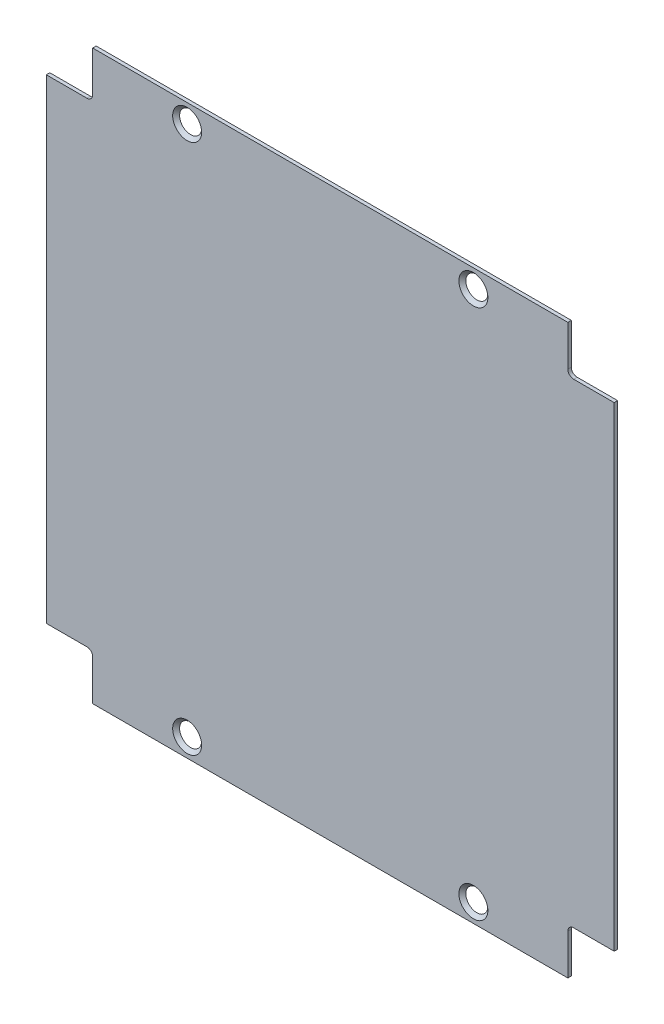
ISO-10303-21;
HEADER;
FILE_DESCRIPTION(('STEP AP214'),'2;1');
FILE_NAME('part.step','',(''),(''),'','','');
FILE_SCHEMA(('AUTOMOTIVE_DESIGN { 1 0 10303 214 1 1 1 1 }'));
ENDSEC;
DATA;
#1=APPLICATION_CONTEXT('core data for automotive mechanical design processes');
#2=APPLICATION_PROTOCOL_DEFINITION('international standard','automotive_design',2000,#1);
#3=PRODUCT_CONTEXT('',#1,'mechanical');
#4=PRODUCT('Part','Part','',(#3));
#5=PRODUCT_RELATED_PRODUCT_CATEGORY('part','',(#4));
#6=PRODUCT_DEFINITION_FORMATION('','',#4);
#7=PRODUCT_DEFINITION_CONTEXT('part definition',#1,'design');
#8=PRODUCT_DEFINITION('design','',#6,#7);
#9=PRODUCT_DEFINITION_SHAPE('','',#8);
#10=(LENGTH_UNIT() NAMED_UNIT(*) SI_UNIT(.MILLI.,.METRE.));
#11=(NAMED_UNIT(*) PLANE_ANGLE_UNIT() SI_UNIT($,.RADIAN.));
#12=(NAMED_UNIT(*) SI_UNIT($,.STERADIAN.) SOLID_ANGLE_UNIT());
#13=UNCERTAINTY_MEASURE_WITH_UNIT(LENGTH_MEASURE(1.E-05),#10,'distance_accuracy_value','');
#14=(GEOMETRIC_REPRESENTATION_CONTEXT(3) GLOBAL_UNCERTAINTY_ASSIGNED_CONTEXT((#13)) GLOBAL_UNIT_ASSIGNED_CONTEXT((#10,
#11,#12)) REPRESENTATION_CONTEXT('',''));
#15=CARTESIAN_POINT('',(0.,0.,0.));
#16=DIRECTION('',(0.,0.,1.));
#17=DIRECTION('',(1.,0.,0.));
#18=AXIS2_PLACEMENT_3D('',#15,#16,#17);
#19=CARTESIAN_POINT('',(0.,0.,0.6));
#20=DIRECTION('',(0.,0.,1.));
#21=DIRECTION('',(1.,0.,0.));
#22=AXIS2_PLACEMENT_3D('',#19,#20,#21);
#23=PLANE('',#22);
#24=CARTESIAN_POINT('',(73.7,94.8,0.6));
#25=DIRECTION('',(0.,0.,1.));
#26=DIRECTION('',(1.,0.,0.));
#27=AXIS2_PLACEMENT_3D('',#24,#25,#26);
#28=CIRCLE('',#27,2.50000738707713);
#29=CARTESIAN_POINT('',(76.2000073870771,94.8,0.6));
#30=VERTEX_POINT('',#29);
#31=EDGE_CURVE('E236',#30,#30,#28,.F.);
#32=ORIENTED_EDGE('',*,*,#31,.T.);
#33=EDGE_LOOP('',(#32));
#34=FACE_BOUND('',#33,.T.);
#35=CARTESIAN_POINT('',(73.7,3.2,0.6));
#36=DIRECTION('',(0.,0.,1.));
#37=DIRECTION('',(1.,0.,0.));
#38=AXIS2_PLACEMENT_3D('',#35,#36,#37);
#39=CIRCLE('',#38,2.50000738721893);
#40=CARTESIAN_POINT('',(76.2000073872189,3.2,0.6));
#41=VERTEX_POINT('',#40);
#42=EDGE_CURVE('E239',#41,#41,#39,.F.);
#43=ORIENTED_EDGE('',*,*,#42,.T.);
#44=EDGE_LOOP('',(#43));
#45=FACE_BOUND('',#44,.T.);
#46=CARTESIAN_POINT('',(24.3,3.2,0.6));
#47=DIRECTION('',(0.,0.,1.));
#48=DIRECTION('',(1.,0.,0.));
#49=AXIS2_PLACEMENT_3D('',#46,#47,#48);
#50=CIRCLE('',#49,2.50000738721893);
#51=CARTESIAN_POINT('',(26.8000073872189,3.2,0.6));
#52=VERTEX_POINT('',#51);
#53=EDGE_CURVE('E242',#52,#52,#50,.F.);
#54=ORIENTED_EDGE('',*,*,#53,.T.);
#55=EDGE_LOOP('',(#54));
#56=FACE_BOUND('',#55,.T.);
#57=CARTESIAN_POINT('',(24.3,94.8,0.6));
#58=DIRECTION('',(0.,0.,1.));
#59=DIRECTION('',(1.,0.,0.));
#60=AXIS2_PLACEMENT_3D('',#57,#58,#59);
#61=CIRCLE('',#60,2.50000738707713);
#62=CARTESIAN_POINT('',(26.8000073870771,94.8,0.6));
#63=VERTEX_POINT('',#62);
#64=EDGE_CURVE('E141',#63,#63,#61,.F.);
#65=ORIENTED_EDGE('',*,*,#64,.T.);
#66=EDGE_LOOP('',(#65));
#67=FACE_BOUND('',#66,.T.);
#68=DIRECTION('',(1.,0.,0.));
#69=VECTOR('',#68,1.);
#70=CARTESIAN_POINT('',(91.,90.,0.6));
#71=LINE('',#70,#69);
#72=CARTESIAN_POINT('',(98.,90.,0.6));
#73=VERTEX_POINT('',#72);
#74=CARTESIAN_POINT('',(91.,90.,0.6));
#75=VERTEX_POINT('',#74);
#76=EDGE_CURVE('E139',#73,#75,#71,.F.);
#77=ORIENTED_EDGE('',*,*,#76,.T.);
#78=CARTESIAN_POINT('',(91.,91.,0.6));
#79=DIRECTION('',(0.,0.,1.));
#80=DIRECTION('',(1.,0.,0.));
#81=AXIS2_PLACEMENT_3D('',#78,#79,#80);
#82=CIRCLE('',#81,1.);
#83=CARTESIAN_POINT('',(90.,91.,0.6));
#84=VERTEX_POINT('',#83);
#85=EDGE_CURVE('E20',#75,#84,#82,.F.);
#86=ORIENTED_EDGE('',*,*,#85,.T.);
#87=DIRECTION('',(0.,1.,0.));
#88=VECTOR('',#87,1.);
#89=CARTESIAN_POINT('',(90.,98.,0.6));
#90=LINE('',#89,#88);
#91=CARTESIAN_POINT('',(90.,98.,0.6));
#92=VERTEX_POINT('',#91);
#93=EDGE_CURVE('E204',#84,#92,#90,.T.);
#94=ORIENTED_EDGE('',*,*,#93,.T.);
#95=DIRECTION('',(1.,0.,0.));
#96=VECTOR('',#95,1.);
#97=CARTESIAN_POINT('',(98.,98.,0.6));
#98=LINE('',#97,#96);
#99=CARTESIAN_POINT('',(8.,98.,0.6));
#100=VERTEX_POINT('',#99);
#101=EDGE_CURVE('E201',#100,#92,#98,.T.);
#102=ORIENTED_EDGE('',*,*,#101,.F.);
#103=DIRECTION('',(0.,1.,0.));
#104=VECTOR('',#103,1.);
#105=CARTESIAN_POINT('',(8.,91.,0.6));
#106=LINE('',#105,#104);
#107=CARTESIAN_POINT('',(8.,91.,0.6));
#108=VERTEX_POINT('',#107);
#109=EDGE_CURVE('E195',#100,#108,#106,.F.);
#110=ORIENTED_EDGE('',*,*,#109,.T.);
#111=CARTESIAN_POINT('',(7.,91.,0.6));
#112=DIRECTION('',(0.,0.,1.));
#113=DIRECTION('',(1.,0.,0.));
#114=AXIS2_PLACEMENT_3D('',#111,#112,#113);
#115=CIRCLE('',#114,1.);
#116=CARTESIAN_POINT('',(7.,90.,0.6));
#117=VERTEX_POINT('',#116);
#118=EDGE_CURVE('E250',#108,#117,#115,.F.);
#119=ORIENTED_EDGE('',*,*,#118,.T.);
#120=DIRECTION('',(1.,0.,0.));
#121=VECTOR('',#120,1.);
#122=CARTESIAN_POINT('',(0.,90.,0.6));
#123=LINE('',#122,#121);
#124=CARTESIAN_POINT('',(0.,90.,0.6));
#125=VERTEX_POINT('',#124);
#126=EDGE_CURVE('E187',#117,#125,#123,.F.);
#127=ORIENTED_EDGE('',*,*,#126,.T.);
#128=DIRECTION('',(0.,1.,0.));
#129=VECTOR('',#128,1.);
#130=CARTESIAN_POINT('',(0.,98.,0.6));
#131=LINE('',#130,#129);
#132=CARTESIAN_POINT('',(0.,8.,0.6));
#133=VERTEX_POINT('',#132);
#134=EDGE_CURVE('E184',#133,#125,#131,.T.);
#135=ORIENTED_EDGE('',*,*,#134,.F.);
#136=DIRECTION('',(1.,0.,0.));
#137=VECTOR('',#136,1.);
#138=CARTESIAN_POINT('',(7.,8.,0.6));
#139=LINE('',#138,#137);
#140=CARTESIAN_POINT('',(7.,8.,0.6));
#141=VERTEX_POINT('',#140);
#142=EDGE_CURVE('E178',#133,#141,#139,.T.);
#143=ORIENTED_EDGE('',*,*,#142,.T.);
#144=CARTESIAN_POINT('',(7.,7.,0.6));
#145=DIRECTION('',(0.,0.,1.));
#146=DIRECTION('',(1.,0.,0.));
#147=AXIS2_PLACEMENT_3D('',#144,#145,#146);
#148=CIRCLE('',#147,1.);
#149=CARTESIAN_POINT('',(8.,7.,0.6));
#150=VERTEX_POINT('',#149);
#151=EDGE_CURVE('E249',#141,#150,#148,.F.);
#152=ORIENTED_EDGE('',*,*,#151,.T.);
#153=DIRECTION('',(0.,1.,0.));
#154=VECTOR('',#153,1.);
#155=CARTESIAN_POINT('',(8.,0.,0.6));
#156=LINE('',#155,#154);
#157=CARTESIAN_POINT('',(8.,0.,0.6));
#158=VERTEX_POINT('',#157);
#159=EDGE_CURVE('E170',#150,#158,#156,.F.);
#160=ORIENTED_EDGE('',*,*,#159,.T.);
#161=DIRECTION('',(1.,0.,0.));
#162=VECTOR('',#161,1.);
#163=CARTESIAN_POINT('',(0.,0.,0.6));
#164=LINE('',#163,#162);
#165=CARTESIAN_POINT('',(90.,0.,0.6));
#166=VERTEX_POINT('',#165);
#167=EDGE_CURVE('E167',#166,#158,#164,.F.);
#168=ORIENTED_EDGE('',*,*,#167,.F.);
#169=DIRECTION('',(0.,1.,0.));
#170=VECTOR('',#169,1.);
#171=CARTESIAN_POINT('',(90.,7.,0.6));
#172=LINE('',#171,#170);
#173=CARTESIAN_POINT('',(90.,7.,0.6));
#174=VERTEX_POINT('',#173);
#175=EDGE_CURVE('E161',#166,#174,#172,.T.);
#176=ORIENTED_EDGE('',*,*,#175,.T.);
#177=CARTESIAN_POINT('',(91.,7.,0.6));
#178=DIRECTION('',(0.,0.,1.));
#179=DIRECTION('',(1.,0.,0.));
#180=AXIS2_PLACEMENT_3D('',#177,#178,#179);
#181=CIRCLE('',#180,1.);
#182=CARTESIAN_POINT('',(91.,8.,0.6));
#183=VERTEX_POINT('',#182);
#184=EDGE_CURVE('E247',#174,#183,#181,.F.);
#185=ORIENTED_EDGE('',*,*,#184,.T.);
#186=DIRECTION('',(1.,0.,0.));
#187=VECTOR('',#186,1.);
#188=CARTESIAN_POINT('',(98.,8.,0.6));
#189=LINE('',#188,#187);
#190=CARTESIAN_POINT('',(98.,8.,0.6));
#191=VERTEX_POINT('',#190);
#192=EDGE_CURVE('E154',#183,#191,#189,.T.);
#193=ORIENTED_EDGE('',*,*,#192,.T.);
#194=DIRECTION('',(0.,1.,0.));
#195=VECTOR('',#194,1.);
#196=CARTESIAN_POINT('',(98.,0.,0.6));
#197=LINE('',#196,#195);
#198=EDGE_CURVE('E144',#73,#191,#197,.F.);
#199=ORIENTED_EDGE('',*,*,#198,.F.);
#200=EDGE_LOOP('',(#77,#86,#94,#102,#110,#119,#127,#135,#143,#152,#160,#168,#176,#185,#193,#199));
#201=FACE_BOUND('',#200,.T.);
#202=ADVANCED_FACE('F17',(#34,#45,#56,#67,#201),#23,.T.);
#203=CARTESIAN_POINT('',(91.,91.,0.));
#204=DIRECTION('',(0.,0.,1.));
#205=DIRECTION('',(1.,0.,0.));
#206=AXIS2_PLACEMENT_3D('',#203,#204,#205);
#207=CYLINDRICAL_SURFACE('',#206,1.);
#208=ORIENTED_EDGE('',*,*,#85,.F.);
#209=DIRECTION('',(0.,0.,-1.));
#210=VECTOR('',#209,1.);
#211=CARTESIAN_POINT('',(91.,90.,0.));
#212=LINE('',#211,#210);
#213=CARTESIAN_POINT('',(91.,90.,0.));
#214=VERTEX_POINT('',#213);
#215=EDGE_CURVE('E132',#75,#214,#212,.T.);
#216=ORIENTED_EDGE('',*,*,#215,.T.);
#217=CARTESIAN_POINT('',(91.,91.,0.));
#218=DIRECTION('',(0.,0.,1.));
#219=DIRECTION('',(1.,0.,0.));
#220=AXIS2_PLACEMENT_3D('',#217,#218,#219);
#221=CIRCLE('',#220,1.);
#222=CARTESIAN_POINT('',(90.,91.,0.));
#223=VERTEX_POINT('',#222);
#224=EDGE_CURVE('E233',#214,#223,#221,.F.);
#225=ORIENTED_EDGE('',*,*,#224,.T.);
#226=DIRECTION('',(0.,0.,1.));
#227=VECTOR('',#226,1.);
#228=CARTESIAN_POINT('',(90.,91.,0.));
#229=LINE('',#228,#227);
#230=EDGE_CURVE('E133',#223,#84,#229,.T.);
#231=ORIENTED_EDGE('',*,*,#230,.T.);
#232=EDGE_LOOP('',(#208,#216,#225,#231));
#233=FACE_BOUND('',#232,.T.);
#234=ADVANCED_FACE('F130',(#233),#207,.F.);
#235=CARTESIAN_POINT('',(90.,98.,0.));
#236=DIRECTION('',(-1.,0.,0.));
#237=DIRECTION('',(0.,0.,1.));
#238=AXIS2_PLACEMENT_3D('',#235,#236,#237);
#239=PLANE('',#238);
#240=ORIENTED_EDGE('',*,*,#93,.F.);
#241=ORIENTED_EDGE('',*,*,#230,.F.);
#242=DIRECTION('',(0.,1.,0.));
#243=VECTOR('',#242,1.);
#244=CARTESIAN_POINT('',(90.,0.,0.));
#245=LINE('',#244,#243);
#246=CARTESIAN_POINT('',(90.,98.,0.));
#247=VERTEX_POINT('',#246);
#248=EDGE_CURVE('E235',#223,#247,#245,.T.);
#249=ORIENTED_EDGE('',*,*,#248,.T.);
#250=DIRECTION('',(0.,0.,1.));
#251=VECTOR('',#250,1.);
#252=CARTESIAN_POINT('',(90.,98.,0.));
#253=LINE('',#252,#251);
#254=EDGE_CURVE('E203',#92,#247,#253,.F.);
#255=ORIENTED_EDGE('',*,*,#254,.F.);
#256=EDGE_LOOP('',(#240,#241,#249,#255));
#257=FACE_BOUND('',#256,.T.);
#258=ADVANCED_FACE('F284',(#257),#239,.F.);
#259=CARTESIAN_POINT('',(98.,98.,0.));
#260=DIRECTION('',(0.,1.,0.));
#261=DIRECTION('',(0.,0.,1.));
#262=AXIS2_PLACEMENT_3D('',#259,#260,#261);
#263=PLANE('',#262);
#264=ORIENTED_EDGE('',*,*,#101,.T.);
#265=ORIENTED_EDGE('',*,*,#254,.T.);
#266=DIRECTION('',(1.,0.,0.));
#267=VECTOR('',#266,1.);
#268=CARTESIAN_POINT('',(0.,98.,0.));
#269=LINE('',#268,#267);
#270=CARTESIAN_POINT('',(8.,98.,0.));
#271=VERTEX_POINT('',#270);
#272=EDGE_CURVE('E266',#247,#271,#269,.F.);
#273=ORIENTED_EDGE('',*,*,#272,.T.);
#274=DIRECTION('',(0.,0.,-1.));
#275=VECTOR('',#274,1.);
#276=CARTESIAN_POINT('',(8.,98.,0.));
#277=LINE('',#276,#275);
#278=EDGE_CURVE('E198',#271,#100,#277,.F.);
#279=ORIENTED_EDGE('',*,*,#278,.T.);
#280=EDGE_LOOP('',(#264,#265,#273,#279));
#281=FACE_BOUND('',#280,.T.);
#282=ADVANCED_FACE('F275',(#281),#263,.T.);
#283=CARTESIAN_POINT('',(8.,91.,0.));
#284=DIRECTION('',(1.,0.,0.));
#285=DIRECTION('',(0.,0.,-1.));
#286=AXIS2_PLACEMENT_3D('',#283,#284,#285);
#287=PLANE('',#286);
#288=ORIENTED_EDGE('',*,*,#109,.F.);
#289=ORIENTED_EDGE('',*,*,#278,.F.);
#290=DIRECTION('',(0.,1.,0.));
#291=VECTOR('',#290,1.);
#292=CARTESIAN_POINT('',(8.,0.,0.));
#293=LINE('',#292,#291);
#294=CARTESIAN_POINT('',(8.,91.,0.));
#295=VERTEX_POINT('',#294);
#296=EDGE_CURVE('E232',#271,#295,#293,.F.);
#297=ORIENTED_EDGE('',*,*,#296,.T.);
#298=DIRECTION('',(0.,0.,1.));
#299=VECTOR('',#298,1.);
#300=CARTESIAN_POINT('',(8.,91.,0.));
#301=LINE('',#300,#299);
#302=EDGE_CURVE('E197',#295,#108,#301,.T.);
#303=ORIENTED_EDGE('',*,*,#302,.T.);
#304=EDGE_LOOP('',(#288,#289,#297,#303));
#305=FACE_BOUND('',#304,.T.);
#306=ADVANCED_FACE('F349',(#305),#287,.F.);
#307=CARTESIAN_POINT('',(7.,91.,0.));
#308=DIRECTION('',(0.,0.,1.));
#309=DIRECTION('',(1.,0.,0.));
#310=AXIS2_PLACEMENT_3D('',#307,#308,#309);
#311=CYLINDRICAL_SURFACE('',#310,1.);
#312=ORIENTED_EDGE('',*,*,#118,.F.);
#313=ORIENTED_EDGE('',*,*,#302,.F.);
#314=CARTESIAN_POINT('',(7.,91.,0.));
#315=DIRECTION('',(0.,0.,1.));
#316=DIRECTION('',(1.,0.,0.));
#317=AXIS2_PLACEMENT_3D('',#314,#315,#316);
#318=CIRCLE('',#317,1.);
#319=CARTESIAN_POINT('',(7.,90.,0.));
#320=VERTEX_POINT('',#319);
#321=EDGE_CURVE('E228',#295,#320,#318,.F.);
#322=ORIENTED_EDGE('',*,*,#321,.T.);
#323=DIRECTION('',(0.,0.,-1.));
#324=VECTOR('',#323,1.);
#325=CARTESIAN_POINT('',(7.,90.,0.));
#326=LINE('',#325,#324);
#327=EDGE_CURVE('E192',#320,#117,#326,.F.);
#328=ORIENTED_EDGE('',*,*,#327,.T.);
#329=EDGE_LOOP('',(#312,#313,#322,#328));
#330=FACE_BOUND('',#329,.T.);
#331=ADVANCED_FACE('F351',(#330),#311,.F.);
#332=CARTESIAN_POINT('',(0.,90.,0.));
#333=DIRECTION('',(0.,-1.,0.));
#334=DIRECTION('',(0.,0.,-1.));
#335=AXIS2_PLACEMENT_3D('',#332,#333,#334);
#336=PLANE('',#335);
#337=ORIENTED_EDGE('',*,*,#126,.F.);
#338=ORIENTED_EDGE('',*,*,#327,.F.);
#339=DIRECTION('',(1.,0.,0.));
#340=VECTOR('',#339,1.);
#341=CARTESIAN_POINT('',(0.,90.,0.));
#342=LINE('',#341,#340);
#343=CARTESIAN_POINT('',(0.,90.,0.));
#344=VERTEX_POINT('',#343);
#345=EDGE_CURVE('E231',#320,#344,#342,.F.);
#346=ORIENTED_EDGE('',*,*,#345,.T.);
#347=DIRECTION('',(0.,0.,1.));
#348=VECTOR('',#347,1.);
#349=CARTESIAN_POINT('',(0.,90.,0.));
#350=LINE('',#349,#348);
#351=EDGE_CURVE('E186',#125,#344,#350,.F.);
#352=ORIENTED_EDGE('',*,*,#351,.F.);
#353=EDGE_LOOP('',(#337,#338,#346,#352));
#354=FACE_BOUND('',#353,.T.);
#355=ADVANCED_FACE('F342',(#354),#336,.F.);
#356=CARTESIAN_POINT('',(0.,98.,0.));
#357=DIRECTION('',(-1.,0.,0.));
#358=DIRECTION('',(0.,0.,1.));
#359=AXIS2_PLACEMENT_3D('',#356,#357,#358);
#360=PLANE('',#359);
#361=ORIENTED_EDGE('',*,*,#134,.T.);
#362=ORIENTED_EDGE('',*,*,#351,.T.);
#363=DIRECTION('',(0.,1.,0.));
#364=VECTOR('',#363,1.);
#365=CARTESIAN_POINT('',(0.,0.,0.));
#366=LINE('',#365,#364);
#367=CARTESIAN_POINT('',(0.,8.,0.));
#368=VERTEX_POINT('',#367);
#369=EDGE_CURVE('E326',#344,#368,#366,.F.);
#370=ORIENTED_EDGE('',*,*,#369,.T.);
#371=DIRECTION('',(0.,0.,1.));
#372=VECTOR('',#371,1.);
#373=CARTESIAN_POINT('',(0.,8.,0.));
#374=LINE('',#373,#372);
#375=EDGE_CURVE('E181',#368,#133,#374,.T.);
#376=ORIENTED_EDGE('',*,*,#375,.T.);
#377=EDGE_LOOP('',(#361,#362,#370,#376));
#378=FACE_BOUND('',#377,.T.);
#379=ADVANCED_FACE('F335',(#378),#360,.T.);
#380=CARTESIAN_POINT('',(7.,8.,0.));
#381=DIRECTION('',(0.,1.,0.));
#382=DIRECTION('',(0.,0.,1.));
#383=AXIS2_PLACEMENT_3D('',#380,#381,#382);
#384=PLANE('',#383);
#385=ORIENTED_EDGE('',*,*,#142,.F.);
#386=ORIENTED_EDGE('',*,*,#375,.F.);
#387=DIRECTION('',(1.,0.,0.));
#388=VECTOR('',#387,1.);
#389=CARTESIAN_POINT('',(0.,8.,0.));
#390=LINE('',#389,#388);
#391=CARTESIAN_POINT('',(7.,8.,0.));
#392=VERTEX_POINT('',#391);
#393=EDGE_CURVE('E227',#368,#392,#390,.T.);
#394=ORIENTED_EDGE('',*,*,#393,.T.);
#395=DIRECTION('',(0.,0.,1.));
#396=VECTOR('',#395,1.);
#397=CARTESIAN_POINT('',(7.,8.,0.));
#398=LINE('',#397,#396);
#399=EDGE_CURVE('E180',#392,#141,#398,.T.);
#400=ORIENTED_EDGE('',*,*,#399,.T.);
#401=EDGE_LOOP('',(#385,#386,#394,#400));
#402=FACE_BOUND('',#401,.T.);
#403=ADVANCED_FACE('F414',(#402),#384,.F.);
#404=CARTESIAN_POINT('',(7.,7.,0.));
#405=DIRECTION('',(0.,0.,1.));
#406=DIRECTION('',(1.,0.,0.));
#407=AXIS2_PLACEMENT_3D('',#404,#405,#406);
#408=CYLINDRICAL_SURFACE('',#407,1.);
#409=ORIENTED_EDGE('',*,*,#151,.F.);
#410=ORIENTED_EDGE('',*,*,#399,.F.);
#411=CARTESIAN_POINT('',(7.,7.,0.));
#412=DIRECTION('',(0.,0.,1.));
#413=DIRECTION('',(1.,0.,0.));
#414=AXIS2_PLACEMENT_3D('',#411,#412,#413);
#415=CIRCLE('',#414,1.);
#416=CARTESIAN_POINT('',(8.,7.,0.));
#417=VERTEX_POINT('',#416);
#418=EDGE_CURVE('E223',#392,#417,#415,.F.);
#419=ORIENTED_EDGE('',*,*,#418,.T.);
#420=DIRECTION('',(0.,0.,-1.));
#421=VECTOR('',#420,1.);
#422=CARTESIAN_POINT('',(8.,7.,0.));
#423=LINE('',#422,#421);
#424=EDGE_CURVE('E175',#417,#150,#423,.F.);
#425=ORIENTED_EDGE('',*,*,#424,.T.);
#426=EDGE_LOOP('',(#409,#410,#419,#425));
#427=FACE_BOUND('',#426,.T.);
#428=ADVANCED_FACE('F410',(#427),#408,.F.);
#429=CARTESIAN_POINT('',(8.,0.,0.));
#430=DIRECTION('',(1.,0.,0.));
#431=DIRECTION('',(0.,0.,-1.));
#432=AXIS2_PLACEMENT_3D('',#429,#430,#431);
#433=PLANE('',#432);
#434=ORIENTED_EDGE('',*,*,#159,.F.);
#435=ORIENTED_EDGE('',*,*,#424,.F.);
#436=DIRECTION('',(0.,1.,0.));
#437=VECTOR('',#436,1.);
#438=CARTESIAN_POINT('',(8.,0.,0.));
#439=LINE('',#438,#437);
#440=CARTESIAN_POINT('',(8.,0.,0.));
#441=VERTEX_POINT('',#440);
#442=EDGE_CURVE('E226',#417,#441,#439,.F.);
#443=ORIENTED_EDGE('',*,*,#442,.T.);
#444=DIRECTION('',(0.,0.,-1.));
#445=VECTOR('',#444,1.);
#446=CARTESIAN_POINT('',(8.,0.,0.));
#447=LINE('',#446,#445);
#448=EDGE_CURVE('E169',#158,#441,#447,.T.);
#449=ORIENTED_EDGE('',*,*,#448,.F.);
#450=EDGE_LOOP('',(#434,#435,#443,#449));
#451=FACE_BOUND('',#450,.T.);
#452=ADVANCED_FACE('F406',(#451),#433,.F.);
#453=CARTESIAN_POINT('',(0.,0.,0.));
#454=DIRECTION('',(0.,-1.,0.));
#455=DIRECTION('',(0.,0.,-1.));
#456=AXIS2_PLACEMENT_3D('',#453,#454,#455);
#457=PLANE('',#456);
#458=DIRECTION('',(1.,0.,0.));
#459=VECTOR('',#458,1.);
#460=CARTESIAN_POINT('',(0.,0.,0.));
#461=LINE('',#460,#459);
#462=CARTESIAN_POINT('',(90.,0.,0.));
#463=VERTEX_POINT('',#462);
#464=EDGE_CURVE('E310',#441,#463,#461,.T.);
#465=ORIENTED_EDGE('',*,*,#464,.T.);
#466=DIRECTION('',(0.,0.,1.));
#467=VECTOR('',#466,1.);
#468=CARTESIAN_POINT('',(90.,0.,0.));
#469=LINE('',#468,#467);
#470=EDGE_CURVE('E164',#463,#166,#469,.T.);
#471=ORIENTED_EDGE('',*,*,#470,.T.);
#472=ORIENTED_EDGE('',*,*,#167,.T.);
#473=ORIENTED_EDGE('',*,*,#448,.T.);
#474=EDGE_LOOP('',(#465,#471,#472,#473));
#475=FACE_BOUND('',#474,.T.);
#476=ADVANCED_FACE('F402',(#475),#457,.T.);
#477=CARTESIAN_POINT('',(90.,7.,0.));
#478=DIRECTION('',(-1.,0.,0.));
#479=DIRECTION('',(0.,0.,1.));
#480=AXIS2_PLACEMENT_3D('',#477,#478,#479);
#481=PLANE('',#480);
#482=ORIENTED_EDGE('',*,*,#175,.F.);
#483=ORIENTED_EDGE('',*,*,#470,.F.);
#484=DIRECTION('',(0.,1.,0.));
#485=VECTOR('',#484,1.);
#486=CARTESIAN_POINT('',(90.,0.,0.));
#487=LINE('',#486,#485);
#488=CARTESIAN_POINT('',(90.,7.,0.));
#489=VERTEX_POINT('',#488);
#490=EDGE_CURVE('E222',#463,#489,#487,.T.);
#491=ORIENTED_EDGE('',*,*,#490,.T.);
#492=DIRECTION('',(0.,0.,1.));
#493=VECTOR('',#492,1.);
#494=CARTESIAN_POINT('',(90.,7.,0.));
#495=LINE('',#494,#493);
#496=EDGE_CURVE('E163',#489,#174,#495,.T.);
#497=ORIENTED_EDGE('',*,*,#496,.T.);
#498=EDGE_LOOP('',(#482,#483,#491,#497));
#499=FACE_BOUND('',#498,.T.);
#500=ADVANCED_FACE('F398',(#499),#481,.F.);
#501=CARTESIAN_POINT('',(91.,7.,0.));
#502=DIRECTION('',(0.,0.,1.));
#503=DIRECTION('',(1.,0.,0.));
#504=AXIS2_PLACEMENT_3D('',#501,#502,#503);
#505=CYLINDRICAL_SURFACE('',#504,1.);
#506=ORIENTED_EDGE('',*,*,#184,.F.);
#507=ORIENTED_EDGE('',*,*,#496,.F.);
#508=CARTESIAN_POINT('',(91.,7.,0.));
#509=DIRECTION('',(0.,0.,1.));
#510=DIRECTION('',(1.,0.,0.));
#511=AXIS2_PLACEMENT_3D('',#508,#509,#510);
#512=CIRCLE('',#511,1.);
#513=CARTESIAN_POINT('',(91.,8.,0.));
#514=VERTEX_POINT('',#513);
#515=EDGE_CURVE('E218',#489,#514,#512,.F.);
#516=ORIENTED_EDGE('',*,*,#515,.T.);
#517=DIRECTION('',(0.,0.,1.));
#518=VECTOR('',#517,1.);
#519=CARTESIAN_POINT('',(91.,8.,0.));
#520=LINE('',#519,#518);
#521=EDGE_CURVE('E158',#514,#183,#520,.T.);
#522=ORIENTED_EDGE('',*,*,#521,.T.);
#523=EDGE_LOOP('',(#506,#507,#516,#522));
#524=FACE_BOUND('',#523,.T.);
#525=ADVANCED_FACE('F394',(#524),#505,.F.);
#526=CARTESIAN_POINT('',(98.,8.,0.));
#527=DIRECTION('',(0.,1.,0.));
#528=DIRECTION('',(0.,0.,1.));
#529=AXIS2_PLACEMENT_3D('',#526,#527,#528);
#530=PLANE('',#529);
#531=ORIENTED_EDGE('',*,*,#192,.F.);
#532=ORIENTED_EDGE('',*,*,#521,.F.);
#533=DIRECTION('',(1.,0.,0.));
#534=VECTOR('',#533,1.);
#535=CARTESIAN_POINT('',(0.,8.,0.));
#536=LINE('',#535,#534);
#537=CARTESIAN_POINT('',(98.,8.,0.));
#538=VERTEX_POINT('',#537);
#539=EDGE_CURVE('E221',#514,#538,#536,.T.);
#540=ORIENTED_EDGE('',*,*,#539,.T.);
#541=DIRECTION('',(0.,0.,-1.));
#542=VECTOR('',#541,1.);
#543=CARTESIAN_POINT('',(98.,8.,0.));
#544=LINE('',#543,#542);
#545=EDGE_CURVE('E146',#191,#538,#544,.T.);
#546=ORIENTED_EDGE('',*,*,#545,.F.);
#547=EDGE_LOOP('',(#531,#532,#540,#546));
#548=FACE_BOUND('',#547,.T.);
#549=ADVANCED_FACE('F390',(#548),#530,.F.);
#550=CARTESIAN_POINT('',(98.,0.,0.));
#551=DIRECTION('',(1.,0.,0.));
#552=DIRECTION('',(0.,0.,-1.));
#553=AXIS2_PLACEMENT_3D('',#550,#551,#552);
#554=PLANE('',#553);
#555=DIRECTION('',(0.,1.,0.));
#556=VECTOR('',#555,1.);
#557=CARTESIAN_POINT('',(98.,0.,0.));
#558=LINE('',#557,#556);
#559=CARTESIAN_POINT('',(98.,90.,0.));
#560=VERTEX_POINT('',#559);
#561=EDGE_CURVE('E294',#538,#560,#558,.T.);
#562=ORIENTED_EDGE('',*,*,#561,.T.);
#563=DIRECTION('',(0.,0.,-1.));
#564=VECTOR('',#563,1.);
#565=CARTESIAN_POINT('',(98.,90.,0.));
#566=LINE('',#565,#564);
#567=EDGE_CURVE('E35',#560,#73,#566,.F.);
#568=ORIENTED_EDGE('',*,*,#567,.T.);
#569=ORIENTED_EDGE('',*,*,#198,.T.);
#570=ORIENTED_EDGE('',*,*,#545,.T.);
#571=EDGE_LOOP('',(#562,#568,#569,#570));
#572=FACE_BOUND('',#571,.T.);
#573=ADVANCED_FACE('F387',(#572),#554,.T.);
#574=CARTESIAN_POINT('',(91.,90.,0.));
#575=DIRECTION('',(0.,-1.,0.));
#576=DIRECTION('',(0.,0.,-1.));
#577=AXIS2_PLACEMENT_3D('',#574,#575,#576);
#578=PLANE('',#577);
#579=ORIENTED_EDGE('',*,*,#76,.F.);
#580=ORIENTED_EDGE('',*,*,#567,.F.);
#581=DIRECTION('',(1.,0.,0.));
#582=VECTOR('',#581,1.);
#583=CARTESIAN_POINT('',(0.,90.,0.));
#584=LINE('',#583,#582);
#585=EDGE_CURVE('E140',#560,#214,#584,.F.);
#586=ORIENTED_EDGE('',*,*,#585,.T.);
#587=ORIENTED_EDGE('',*,*,#215,.F.);
#588=EDGE_LOOP('',(#579,#580,#586,#587));
#589=FACE_BOUND('',#588,.T.);
#590=ADVANCED_FACE('F138',(#589),#578,.F.);
#591=CARTESIAN_POINT('',(24.3,94.8,0.599988670842322));
#592=DIRECTION('',(0.,0.,1.));
#593=DIRECTION('',(1.,0.,0.));
#594=AXIS2_PLACEMENT_3D('',#591,#592,#593);
#595=CONICAL_SURFACE('',#594,2.49999605788598,0.785399640830988);
#596=CARTESIAN_POINT('',(24.3,94.8,2.06500398378107E-11));
#597=DIRECTION('',(0.,0.,1.));
#598=DIRECTION('',(1.,0.,0.));
#599=AXIS2_PLACEMENT_3D('',#596,#597,#598);
#600=CIRCLE('',#599,1.90000561417492);
#601=CARTESIAN_POINT('',(26.2000056141749,94.8,2.06500398378107E-11));
#602=VERTEX_POINT('',#601);
#603=EDGE_CURVE('E215',#602,#602,#600,.F.);
#604=ORIENTED_EDGE('',*,*,#603,.T.);
#605=EDGE_LOOP('',(#604));
#606=FACE_BOUND('',#605,.T.);
#607=ORIENTED_EDGE('',*,*,#64,.F.);
#608=EDGE_LOOP('',(#607));
#609=FACE_BOUND('',#608,.T.);
#610=ADVANCED_FACE('F380',(#606,#609),#595,.F.);
#611=CARTESIAN_POINT('',(24.3,3.2,0.599988670728635));
#612=DIRECTION('',(0.,0.,1.));
#613=DIRECTION('',(1.,0.,0.));
#614=AXIS2_PLACEMENT_3D('',#611,#612,#613);
#615=CONICAL_SURFACE('',#614,2.49999605791409,0.785399640830988);
#616=CARTESIAN_POINT('',(24.3,3.2,-7.45790148387604E-12));
#617=DIRECTION('',(0.,0.,1.));
#618=DIRECTION('',(1.,0.,0.));
#619=AXIS2_PLACEMENT_3D('',#616,#617,#618);
#620=CIRCLE('',#619,1.9000056142886);
#621=CARTESIAN_POINT('',(26.2000056142886,3.2,-7.45790148387604E-12));
#622=VERTEX_POINT('',#621);
#623=EDGE_CURVE('E212',#622,#622,#620,.F.);
#624=ORIENTED_EDGE('',*,*,#623,.T.);
#625=EDGE_LOOP('',(#624));
#626=FACE_BOUND('',#625,.T.);
#627=ORIENTED_EDGE('',*,*,#53,.F.);
#628=EDGE_LOOP('',(#627));
#629=FACE_BOUND('',#628,.T.);
#630=ADVANCED_FACE('F376',(#626,#629),#615,.F.);
#631=CARTESIAN_POINT('',(73.7,3.2,0.599988670728635));
#632=DIRECTION('',(0.,0.,1.));
#633=DIRECTION('',(1.,0.,0.));
#634=AXIS2_PLACEMENT_3D('',#631,#632,#633);
#635=CONICAL_SURFACE('',#634,2.49999605791409,0.785399640830988);
#636=CARTESIAN_POINT('',(73.7,3.2,4.93854089567147E-11));
#637=DIRECTION('',(0.,0.,1.));
#638=DIRECTION('',(1.,0.,0.));
#639=AXIS2_PLACEMENT_3D('',#636,#637,#638);
#640=CIRCLE('',#639,1.90000561434545);
#641=CARTESIAN_POINT('',(75.6000056143454,3.2,4.93854089567147E-11));
#642=VERTEX_POINT('',#641);
#643=EDGE_CURVE('E26',#642,#642,#640,.F.);
#644=ORIENTED_EDGE('',*,*,#643,.T.);
#645=EDGE_LOOP('',(#644));
#646=FACE_BOUND('',#645,.T.);
#647=ORIENTED_EDGE('',*,*,#42,.F.);
#648=EDGE_LOOP('',(#647));
#649=FACE_BOUND('',#648,.T.);
#650=ADVANCED_FACE('F368',(#646,#649),#635,.F.);
#651=CARTESIAN_POINT('',(73.7,94.8,0.599988670842322));
#652=DIRECTION('',(0.,0.,1.));
#653=DIRECTION('',(1.,0.,0.));
#654=AXIS2_PLACEMENT_3D('',#651,#652,#653);
#655=CONICAL_SURFACE('',#654,2.49999605788598,0.785399640830988);
#656=CARTESIAN_POINT('',(73.7,94.8,2.06500398378107E-11));
#657=DIRECTION('',(0.,0.,1.));
#658=DIRECTION('',(1.,0.,0.));
#659=AXIS2_PLACEMENT_3D('',#656,#657,#658);
#660=CIRCLE('',#659,1.90000561417492);
#661=CARTESIAN_POINT('',(75.6000056141749,94.8,2.06500398378107E-11));
#662=VERTEX_POINT('',#661);
#663=EDGE_CURVE('E11',#662,#662,#660,.F.);
#664=ORIENTED_EDGE('',*,*,#663,.T.);
#665=EDGE_LOOP('',(#664));
#666=FACE_BOUND('',#665,.T.);
#667=ORIENTED_EDGE('',*,*,#31,.F.);
#668=EDGE_LOOP('',(#667));
#669=FACE_BOUND('',#668,.T.);
#670=ADVANCED_FACE('F362',(#666,#669),#655,.F.);
#671=CARTESIAN_POINT('',(0.,0.,0.));
#672=DIRECTION('',(0.,0.,1.));
#673=DIRECTION('',(1.,0.,0.));
#674=AXIS2_PLACEMENT_3D('',#671,#672,#673);
#675=PLANE('',#674);
#676=ORIENTED_EDGE('',*,*,#663,.F.);
#677=EDGE_LOOP('',(#676));
#678=FACE_BOUND('',#677,.T.);
#679=ORIENTED_EDGE('',*,*,#643,.F.);
#680=EDGE_LOOP('',(#679));
#681=FACE_BOUND('',#680,.T.);
#682=ORIENTED_EDGE('',*,*,#623,.F.);
#683=EDGE_LOOP('',(#682));
#684=FACE_BOUND('',#683,.T.);
#685=ORIENTED_EDGE('',*,*,#603,.F.);
#686=EDGE_LOOP('',(#685));
#687=FACE_BOUND('',#686,.T.);
#688=ORIENTED_EDGE('',*,*,#561,.F.);
#689=ORIENTED_EDGE('',*,*,#539,.F.);
#690=ORIENTED_EDGE('',*,*,#515,.F.);
#691=ORIENTED_EDGE('',*,*,#490,.F.);
#692=ORIENTED_EDGE('',*,*,#464,.F.);
#693=ORIENTED_EDGE('',*,*,#442,.F.);
#694=ORIENTED_EDGE('',*,*,#418,.F.);
#695=ORIENTED_EDGE('',*,*,#393,.F.);
#696=ORIENTED_EDGE('',*,*,#369,.F.);
#697=ORIENTED_EDGE('',*,*,#345,.F.);
#698=ORIENTED_EDGE('',*,*,#321,.F.);
#699=ORIENTED_EDGE('',*,*,#296,.F.);
#700=ORIENTED_EDGE('',*,*,#272,.F.);
#701=ORIENTED_EDGE('',*,*,#248,.F.);
#702=ORIENTED_EDGE('',*,*,#224,.F.);
#703=ORIENTED_EDGE('',*,*,#585,.F.);
#704=EDGE_LOOP('',(#688,#689,#690,#691,#692,#693,#694,#695,#696,#697,#698,#699,#700,#701,#702,#703));
#705=FACE_BOUND('',#704,.T.);
#706=ADVANCED_FACE('F282',(#678,#681,#684,#687,#705),#675,.F.);
#707=CLOSED_SHELL('',(#202,#234,#258,#282,#306,#331,#355,#379,#403,#428,#452,#476,#500,#525,
#549,#573,#590,#610,#630,#650,#670,#706));
#708=MANIFOLD_SOLID_BREP('B1',#707);
#709=ADVANCED_BREP_SHAPE_REPRESENTATION('',(#18,#708),#14);
#710=SHAPE_DEFINITION_REPRESENTATION(#9,#709);
ENDSEC;
END-ISO-10303-21;
